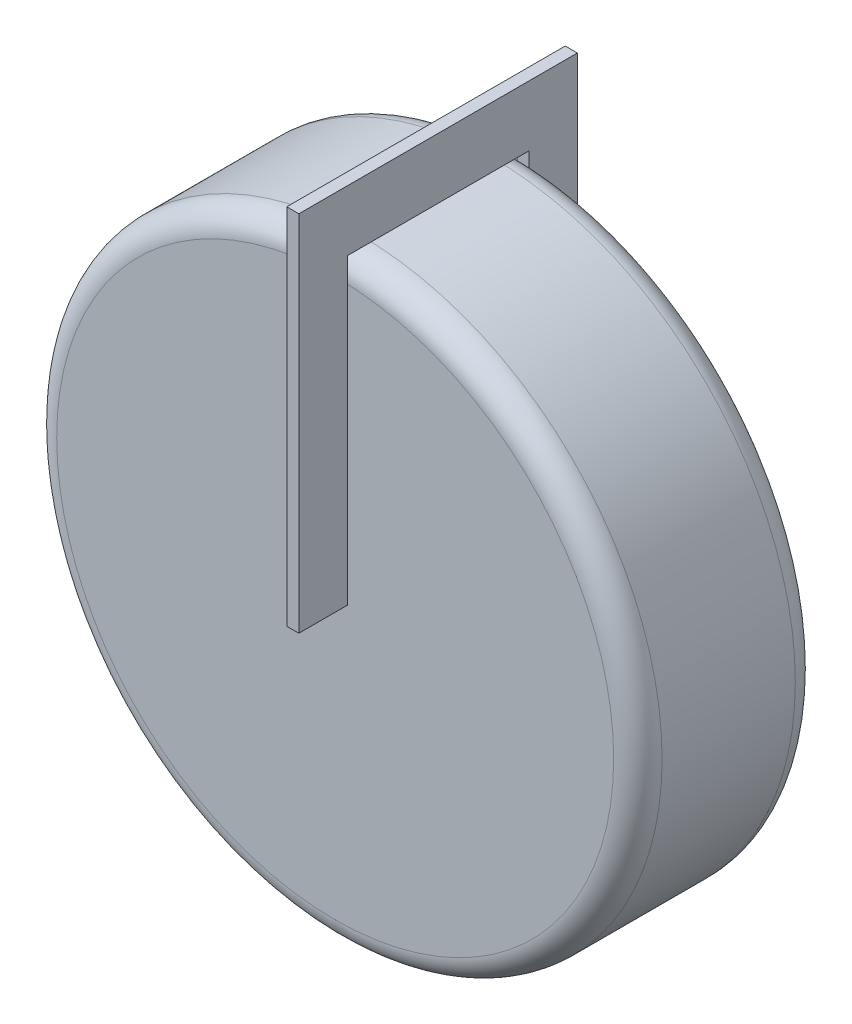
ISO-10303-21;
HEADER;
FILE_DESCRIPTION(('STEP AP214'),'2;1');
FILE_NAME('part.step','',(''),(''),'','','');
FILE_SCHEMA(('AUTOMOTIVE_DESIGN { 1 0 10303 214 1 1 1 1 }'));
ENDSEC;
DATA;
#1=APPLICATION_CONTEXT('core data for automotive mechanical design processes');
#2=APPLICATION_PROTOCOL_DEFINITION('international standard','automotive_design',2000,#1);
#3=PRODUCT_CONTEXT('',#1,'mechanical');
#4=PRODUCT('Part','Part','',(#3));
#5=PRODUCT_RELATED_PRODUCT_CATEGORY('part','',(#4));
#6=PRODUCT_DEFINITION_FORMATION('','',#4);
#7=PRODUCT_DEFINITION_CONTEXT('part definition',#1,'design');
#8=PRODUCT_DEFINITION('design','',#6,#7);
#9=PRODUCT_DEFINITION_SHAPE('','',#8);
#10=(LENGTH_UNIT() NAMED_UNIT(*) SI_UNIT(.MILLI.,.METRE.));
#11=(NAMED_UNIT(*) PLANE_ANGLE_UNIT() SI_UNIT($,.RADIAN.));
#12=(NAMED_UNIT(*) SI_UNIT($,.STERADIAN.) SOLID_ANGLE_UNIT());
#13=UNCERTAINTY_MEASURE_WITH_UNIT(LENGTH_MEASURE(1.E-05),#10,'distance_accuracy_value','');
#14=(GEOMETRIC_REPRESENTATION_CONTEXT(3) GLOBAL_UNCERTAINTY_ASSIGNED_CONTEXT((#13)) GLOBAL_UNIT_ASSIGNED_CONTEXT((#10,
#11,#12)) REPRESENTATION_CONTEXT('',''));
#15=CARTESIAN_POINT('',(0.,0.,0.));
#16=DIRECTION('',(0.,0.,1.));
#17=DIRECTION('',(1.,0.,0.));
#18=AXIS2_PLACEMENT_3D('',#15,#16,#17);
#19=CARTESIAN_POINT('',(1.,30.,0.));
#20=DIRECTION('',(0.,-1.,0.));
#21=DIRECTION('',(0.,0.,-1.));
#22=AXIS2_PLACEMENT_3D('',#19,#20,#21);
#23=PLANE('',#22);
#24=DIRECTION('',(0.,0.,1.));
#25=VECTOR('',#24,1.);
#26=CARTESIAN_POINT('',(0.,30.,0.));
#27=LINE('',#26,#25);
#28=CARTESIAN_POINT('',(0.,30.,-3.99999999999999));
#29=VERTEX_POINT('',#28);
#30=CARTESIAN_POINT('',(0.,30.,19.));
#31=VERTEX_POINT('',#30);
#32=EDGE_CURVE('E151',#29,#31,#27,.T.);
#33=ORIENTED_EDGE('',*,*,#32,.T.);
#34=DIRECTION('',(-1.,0.,0.));
#35=VECTOR('',#34,1.);
#36=CARTESIAN_POINT('',(1.,30.,19.));
#37=LINE('',#36,#35);
#38=CARTESIAN_POINT('',(1.,30.,19.));
#39=VERTEX_POINT('',#38);
#40=EDGE_CURVE('E12',#39,#31,#37,.T.);
#41=ORIENTED_EDGE('',*,*,#40,.F.);
#42=DIRECTION('',(0.,0.,1.));
#43=VECTOR('',#42,1.);
#44=CARTESIAN_POINT('',(1.,30.,0.));
#45=LINE('',#44,#43);
#46=CARTESIAN_POINT('',(1.,30.,-3.99999999999999));
#47=VERTEX_POINT('',#46);
#48=EDGE_CURVE('E169',#47,#39,#45,.T.);
#49=ORIENTED_EDGE('',*,*,#48,.F.);
#50=DIRECTION('',(-1.,0.,0.));
#51=VECTOR('',#50,1.);
#52=CARTESIAN_POINT('',(1.,30.,-3.99999999999999));
#53=LINE('',#52,#51);
#54=EDGE_CURVE('E150',#47,#29,#53,.T.);
#55=ORIENTED_EDGE('',*,*,#54,.T.);
#56=EDGE_LOOP('',(#33,#41,#49,#55));
#57=FACE_BOUND('',#56,.T.);
#58=ADVANCED_FACE('F53',(#57),#23,.F.);
#59=CARTESIAN_POINT('',(1.,0.,19.));
#60=DIRECTION('',(0.,0.,-1.));
#61=DIRECTION('',(-1.,0.,0.));
#62=AXIS2_PLACEMENT_3D('',#59,#60,#61);
#63=PLANE('',#62);
#64=DIRECTION('',(0.,-1.,0.));
#65=VECTOR('',#64,1.);
#66=CARTESIAN_POINT('',(0.,0.,19.));
#67=LINE('',#66,#65);
#68=CARTESIAN_POINT('',(0.,0.,19.));
#69=VERTEX_POINT('',#68);
#70=EDGE_CURVE('E154',#31,#69,#67,.T.);
#71=ORIENTED_EDGE('',*,*,#70,.T.);
#72=DIRECTION('',(-1.,0.,0.));
#73=VECTOR('',#72,1.);
#74=CARTESIAN_POINT('',(1.,0.,19.));
#75=LINE('',#74,#73);
#76=CARTESIAN_POINT('',(1.,0.,19.));
#77=VERTEX_POINT('',#76);
#78=EDGE_CURVE('E61',#77,#69,#75,.T.);
#79=ORIENTED_EDGE('',*,*,#78,.F.);
#80=DIRECTION('',(0.,-1.,0.));
#81=VECTOR('',#80,1.);
#82=CARTESIAN_POINT('',(1.,0.,19.));
#83=LINE('',#82,#81);
#84=EDGE_CURVE('E111',#39,#77,#83,.T.);
#85=ORIENTED_EDGE('',*,*,#84,.F.);
#86=ORIENTED_EDGE('',*,*,#40,.T.);
#87=EDGE_LOOP('',(#71,#79,#85,#86));
#88=FACE_BOUND('',#87,.T.);
#89=ADVANCED_FACE('F182',(#88),#63,.F.);
#90=CARTESIAN_POINT('',(1.,0.,0.));
#91=DIRECTION('',(0.,-1.,0.));
#92=DIRECTION('',(0.,0.,-1.));
#93=AXIS2_PLACEMENT_3D('',#90,#91,#92);
#94=PLANE('',#93);
#95=DIRECTION('',(0.,0.,1.));
#96=VECTOR('',#95,1.);
#97=CARTESIAN_POINT('',(0.,0.,0.));
#98=LINE('',#97,#96);
#99=CARTESIAN_POINT('',(0.,0.,15.));
#100=VERTEX_POINT('',#99);
#101=EDGE_CURVE('E157',#100,#69,#98,.T.);
#102=ORIENTED_EDGE('',*,*,#101,.F.);
#103=DIRECTION('',(-1.,0.,0.));
#104=VECTOR('',#103,1.);
#105=CARTESIAN_POINT('',(1.,0.,15.));
#106=LINE('',#105,#104);
#107=CARTESIAN_POINT('',(1.,0.,15.));
#108=VERTEX_POINT('',#107);
#109=EDGE_CURVE('E175',#108,#100,#106,.T.);
#110=ORIENTED_EDGE('',*,*,#109,.F.);
#111=DIRECTION('',(0.,0.,1.));
#112=VECTOR('',#111,1.);
#113=CARTESIAN_POINT('',(1.,0.,0.));
#114=LINE('',#113,#112);
#115=EDGE_CURVE('E181',#108,#77,#114,.T.);
#116=ORIENTED_EDGE('',*,*,#115,.T.);
#117=ORIENTED_EDGE('',*,*,#78,.T.);
#118=EDGE_LOOP('',(#102,#110,#116,#117));
#119=FACE_BOUND('',#118,.T.);
#120=ADVANCED_FACE('F179',(#119),#94,.T.);
#121=CARTESIAN_POINT('',(1.,0.,15.));
#122=DIRECTION('',(0.,0.,-1.));
#123=DIRECTION('',(0.,1.,0.));
#124=AXIS2_PLACEMENT_3D('',#121,#122,#123);
#125=PLANE('',#124);
#126=DIRECTION('',(0.,-1.,0.));
#127=VECTOR('',#126,1.);
#128=CARTESIAN_POINT('',(0.,0.,15.));
#129=LINE('',#128,#127);
#130=CARTESIAN_POINT('',(0.,25.,15.));
#131=VERTEX_POINT('',#130);
#132=EDGE_CURVE('E160',#131,#100,#129,.T.);
#133=ORIENTED_EDGE('',*,*,#132,.F.);
#134=DIRECTION('',(-1.,0.,0.));
#135=VECTOR('',#134,1.);
#136=CARTESIAN_POINT('',(1.,25.,15.));
#137=LINE('',#136,#135);
#138=CARTESIAN_POINT('',(1.,25.,15.));
#139=VERTEX_POINT('',#138);
#140=EDGE_CURVE('E173',#139,#131,#137,.T.);
#141=ORIENTED_EDGE('',*,*,#140,.F.);
#142=DIRECTION('',(0.,-1.,0.));
#143=VECTOR('',#142,1.);
#144=CARTESIAN_POINT('',(1.,0.,15.));
#145=LINE('',#144,#143);
#146=EDGE_CURVE('E145',#139,#108,#145,.T.);
#147=ORIENTED_EDGE('',*,*,#146,.T.);
#148=ORIENTED_EDGE('',*,*,#109,.T.);
#149=EDGE_LOOP('',(#133,#141,#147,#148));
#150=FACE_BOUND('',#149,.T.);
#151=ADVANCED_FACE('F190',(#150),#125,.T.);
#152=CARTESIAN_POINT('',(1.,25.,0.));
#153=DIRECTION('',(0.,-1.,0.));
#154=DIRECTION('',(0.,0.,-1.));
#155=AXIS2_PLACEMENT_3D('',#152,#153,#154);
#156=PLANE('',#155);
#157=DIRECTION('',(0.,0.,1.));
#158=VECTOR('',#157,1.);
#159=CARTESIAN_POINT('',(0.,25.,0.));
#160=LINE('',#159,#158);
#161=CARTESIAN_POINT('',(0.,25.,0.));
#162=VERTEX_POINT('',#161);
#163=EDGE_CURVE('E163',#162,#131,#160,.T.);
#164=ORIENTED_EDGE('',*,*,#163,.F.);
#165=DIRECTION('',(-1.,0.,0.));
#166=VECTOR('',#165,1.);
#167=CARTESIAN_POINT('',(1.,25.,0.));
#168=LINE('',#167,#166);
#169=CARTESIAN_POINT('',(1.,25.,0.));
#170=VERTEX_POINT('',#169);
#171=EDGE_CURVE('E133',#170,#162,#168,.T.);
#172=ORIENTED_EDGE('',*,*,#171,.F.);
#173=DIRECTION('',(0.,0.,1.));
#174=VECTOR('',#173,1.);
#175=CARTESIAN_POINT('',(1.,25.,0.));
#176=LINE('',#175,#174);
#177=EDGE_CURVE('E143',#170,#139,#176,.T.);
#178=ORIENTED_EDGE('',*,*,#177,.T.);
#179=ORIENTED_EDGE('',*,*,#140,.T.);
#180=EDGE_LOOP('',(#164,#172,#178,#179));
#181=FACE_BOUND('',#180,.T.);
#182=ADVANCED_FACE('F218',(#181),#156,.T.);
#183=CARTESIAN_POINT('',(1.,0.,0.));
#184=DIRECTION('',(0.,0.,1.));
#185=DIRECTION('',(0.,-1.,0.));
#186=AXIS2_PLACEMENT_3D('',#183,#184,#185);
#187=PLANE('',#186);
#188=DIRECTION('',(0.,1.,0.));
#189=VECTOR('',#188,1.);
#190=CARTESIAN_POINT('',(0.,0.,0.));
#191=LINE('',#190,#189);
#192=CARTESIAN_POINT('',(0.,0.,0.));
#193=VERTEX_POINT('',#192);
#194=EDGE_CURVE('E132',#193,#162,#191,.T.);
#195=ORIENTED_EDGE('',*,*,#194,.F.);
#196=DIRECTION('',(-1.,0.,0.));
#197=VECTOR('',#196,1.);
#198=CARTESIAN_POINT('',(1.,0.,0.));
#199=LINE('',#198,#197);
#200=CARTESIAN_POINT('',(1.,0.,0.));
#201=VERTEX_POINT('',#200);
#202=EDGE_CURVE('E126',#201,#193,#199,.T.);
#203=ORIENTED_EDGE('',*,*,#202,.F.);
#204=DIRECTION('',(0.,1.,0.));
#205=VECTOR('',#204,1.);
#206=CARTESIAN_POINT('',(1.,0.,0.));
#207=LINE('',#206,#205);
#208=EDGE_CURVE('E130',#201,#170,#207,.T.);
#209=ORIENTED_EDGE('',*,*,#208,.T.);
#210=ORIENTED_EDGE('',*,*,#171,.T.);
#211=EDGE_LOOP('',(#195,#203,#209,#210));
#212=FACE_BOUND('',#211,.T.);
#213=ADVANCED_FACE('F128',(#212),#187,.T.);
#214=CARTESIAN_POINT('',(1.,0.,0.));
#215=DIRECTION('',(0.,1.,0.));
#216=DIRECTION('',(0.,0.,1.));
#217=AXIS2_PLACEMENT_3D('',#214,#215,#216);
#218=PLANE('',#217);
#219=DIRECTION('',(0.,0.,-1.));
#220=VECTOR('',#219,1.);
#221=CARTESIAN_POINT('',(0.,0.,0.));
#222=LINE('',#221,#220);
#223=CARTESIAN_POINT('',(0.,0.,-4.));
#224=VERTEX_POINT('',#223);
#225=EDGE_CURVE('E97',#193,#224,#222,.T.);
#226=ORIENTED_EDGE('',*,*,#225,.T.);
#227=DIRECTION('',(-1.,0.,0.));
#228=VECTOR('',#227,1.);
#229=CARTESIAN_POINT('',(1.,0.,-4.));
#230=LINE('',#229,#228);
#231=CARTESIAN_POINT('',(1.,0.,-4.));
#232=VERTEX_POINT('',#231);
#233=EDGE_CURVE('E134',#232,#224,#230,.T.);
#234=ORIENTED_EDGE('',*,*,#233,.F.);
#235=DIRECTION('',(0.,0.,-1.));
#236=VECTOR('',#235,1.);
#237=CARTESIAN_POINT('',(1.,0.,0.));
#238=LINE('',#237,#236);
#239=EDGE_CURVE('E136',#201,#232,#238,.T.);
#240=ORIENTED_EDGE('',*,*,#239,.F.);
#241=ORIENTED_EDGE('',*,*,#202,.T.);
#242=EDGE_LOOP('',(#226,#234,#240,#241));
#243=FACE_BOUND('',#242,.T.);
#244=ADVANCED_FACE('F137',(#243),#218,.F.);
#245=CARTESIAN_POINT('',(1.,0.,-4.));
#246=DIRECTION('',(0.,0.,1.));
#247=DIRECTION('',(0.,-1.,0.));
#248=AXIS2_PLACEMENT_3D('',#245,#246,#247);
#249=PLANE('',#248);
#250=DIRECTION('',(0.,1.,0.));
#251=VECTOR('',#250,1.);
#252=CARTESIAN_POINT('',(0.,0.,-4.));
#253=LINE('',#252,#251);
#254=EDGE_CURVE('E103',#224,#29,#253,.T.);
#255=ORIENTED_EDGE('',*,*,#254,.T.);
#256=ORIENTED_EDGE('',*,*,#54,.F.);
#257=DIRECTION('',(0.,1.,0.));
#258=VECTOR('',#257,1.);
#259=CARTESIAN_POINT('',(1.,0.,-4.));
#260=LINE('',#259,#258);
#261=EDGE_CURVE('E69',#232,#47,#260,.T.);
#262=ORIENTED_EDGE('',*,*,#261,.F.);
#263=ORIENTED_EDGE('',*,*,#233,.T.);
#264=EDGE_LOOP('',(#255,#256,#262,#263));
#265=FACE_BOUND('',#264,.T.);
#266=ADVANCED_FACE('F197',(#265),#249,.F.);
#267=CARTESIAN_POINT('',(1.,0.,0.));
#268=DIRECTION('',(1.,0.,0.));
#269=DIRECTION('',(0.,0.,-1.));
#270=AXIS2_PLACEMENT_3D('',#267,#268,#269);
#271=PLANE('',#270);
#272=ORIENTED_EDGE('',*,*,#48,.T.);
#273=ORIENTED_EDGE('',*,*,#84,.T.);
#274=ORIENTED_EDGE('',*,*,#115,.F.);
#275=ORIENTED_EDGE('',*,*,#146,.F.);
#276=ORIENTED_EDGE('',*,*,#177,.F.);
#277=ORIENTED_EDGE('',*,*,#208,.F.);
#278=ORIENTED_EDGE('',*,*,#239,.T.);
#279=ORIENTED_EDGE('',*,*,#261,.T.);
#280=EDGE_LOOP('',(#272,#273,#274,#275,#276,#277,#278,#279));
#281=FACE_BOUND('',#280,.T.);
#282=ADVANCED_FACE('F140',(#281),#271,.T.);
#283=CARTESIAN_POINT('',(0.,0.,0.));
#284=DIRECTION('',(1.,0.,0.));
#285=DIRECTION('',(0.,0.,-1.));
#286=AXIS2_PLACEMENT_3D('',#283,#284,#285);
#287=PLANE('',#286);
#288=ORIENTED_EDGE('',*,*,#32,.F.);
#289=ORIENTED_EDGE('',*,*,#254,.F.);
#290=ORIENTED_EDGE('',*,*,#225,.F.);
#291=ORIENTED_EDGE('',*,*,#194,.T.);
#292=ORIENTED_EDGE('',*,*,#163,.T.);
#293=ORIENTED_EDGE('',*,*,#132,.T.);
#294=ORIENTED_EDGE('',*,*,#101,.T.);
#295=ORIENTED_EDGE('',*,*,#70,.F.);
#296=EDGE_LOOP('',(#288,#289,#290,#291,#292,#293,#294,#295));
#297=FACE_BOUND('',#296,.T.);
#298=ADVANCED_FACE('F186',(#297),#287,.F.);
#299=CLOSED_SHELL('',(#58,#89,#120,#151,#182,#213,#244,#266,#282,#298));
#300=MANIFOLD_SOLID_BREP('B2',#299);
#301=CARTESIAN_POINT('',(0.,0.,15.));
#302=DIRECTION('',(0.,0.,-1.));
#303=DIRECTION('',(-1.,0.,0.));
#304=AXIS2_PLACEMENT_3D('',#301,#302,#303);
#305=CYLINDRICAL_SURFACE('',#304,25.);
#306=CARTESIAN_POINT('',(0.,0.,13.));
#307=DIRECTION('',(0.,0.,1.));
#308=DIRECTION('',(1.,0.,0.));
#309=AXIS2_PLACEMENT_3D('',#306,#307,#308);
#310=CIRCLE('',#309,25.);
#311=CARTESIAN_POINT('',(25.,0.,13.));
#312=VERTEX_POINT('',#311);
#313=EDGE_CURVE('E313',#312,#312,#310,.F.);
#314=ORIENTED_EDGE('',*,*,#313,.T.);
#315=EDGE_LOOP('',(#314));
#316=FACE_BOUND('',#315,.T.);
#317=CARTESIAN_POINT('',(0.,0.,2.));
#318=DIRECTION('',(0.,0.,1.));
#319=DIRECTION('',(1.,0.,0.));
#320=AXIS2_PLACEMENT_3D('',#317,#318,#319);
#321=CIRCLE('',#320,25.);
#322=CARTESIAN_POINT('',(25.,0.,2.));
#323=VERTEX_POINT('',#322);
#324=EDGE_CURVE('E318',#323,#323,#321,.T.);
#325=ORIENTED_EDGE('',*,*,#324,.T.);
#326=EDGE_LOOP('',(#325));
#327=FACE_BOUND('',#326,.T.);
#328=ADVANCED_FACE('F305',(#316,#327),#305,.T.);
#329=CARTESIAN_POINT('',(0.,0.,15.));
#330=DIRECTION('',(0.,0.,1.));
#331=DIRECTION('',(1.,0.,0.));
#332=AXIS2_PLACEMENT_3D('',#329,#330,#331);
#333=PLANE('',#332);
#334=CARTESIAN_POINT('',(0.,0.,15.));
#335=DIRECTION('',(0.,0.,1.));
#336=DIRECTION('',(1.,0.,0.));
#337=AXIS2_PLACEMENT_3D('',#334,#335,#336);
#338=CIRCLE('',#337,23.);
#339=CARTESIAN_POINT('',(23.,0.,15.));
#340=VERTEX_POINT('',#339);
#341=EDGE_CURVE('E323',#340,#340,#338,.T.);
#342=ORIENTED_EDGE('',*,*,#341,.T.);
#343=EDGE_LOOP('',(#342));
#344=FACE_BOUND('',#343,.T.);
#345=ADVANCED_FACE('F330',(#344),#333,.T.);
#346=CARTESIAN_POINT('',(0.,0.,0.));
#347=DIRECTION('',(0.,0.,1.));
#348=DIRECTION('',(1.,0.,0.));
#349=AXIS2_PLACEMENT_3D('',#346,#347,#348);
#350=PLANE('',#349);
#351=CARTESIAN_POINT('',(0.,0.,0.));
#352=DIRECTION('',(0.,0.,1.));
#353=DIRECTION('',(1.,0.,0.));
#354=AXIS2_PLACEMENT_3D('',#351,#352,#353);
#355=CIRCLE('',#354,23.);
#356=CARTESIAN_POINT('',(23.,0.,0.));
#357=VERTEX_POINT('',#356);
#358=EDGE_CURVE('E52',#357,#357,#355,.F.);
#359=ORIENTED_EDGE('',*,*,#358,.T.);
#360=EDGE_LOOP('',(#359));
#361=FACE_BOUND('',#360,.T.);
#362=ADVANCED_FACE('F334',(#361),#350,.F.);
#363=CARTESIAN_POINT('',(0.,0.,13.));
#364=DIRECTION('',(0.,0.,1.));
#365=DIRECTION('',(1.,0.,0.));
#366=AXIS2_PLACEMENT_3D('',#363,#364,#365);
#367=TOROIDAL_SURFACE('',#366,23.,2.);
#368=ORIENTED_EDGE('',*,*,#313,.F.);
#369=EDGE_LOOP('',(#368));
#370=FACE_BOUND('',#369,.T.);
#371=ORIENTED_EDGE('',*,*,#341,.F.);
#372=EDGE_LOOP('',(#371));
#373=FACE_BOUND('',#372,.T.);
#374=ADVANCED_FACE('F332',(#370,#373),#367,.T.);
#375=CARTESIAN_POINT('',(0.,0.,2.));
#376=DIRECTION('',(0.,0.,1.));
#377=DIRECTION('',(1.,0.,0.));
#378=AXIS2_PLACEMENT_3D('',#375,#376,#377);
#379=TOROIDAL_SURFACE('',#378,23.,2.);
#380=ORIENTED_EDGE('',*,*,#358,.F.);
#381=EDGE_LOOP('',(#380));
#382=FACE_BOUND('',#381,.T.);
#383=ORIENTED_EDGE('',*,*,#324,.F.);
#384=EDGE_LOOP('',(#383));
#385=FACE_BOUND('',#384,.T.);
#386=ADVANCED_FACE('F307',(#382,#385),#379,.T.);
#387=CLOSED_SHELL('',(#328,#345,#362,#374,#386));
#388=MANIFOLD_SOLID_BREP('B6',#387);
#389=ADVANCED_BREP_SHAPE_REPRESENTATION('',(#18,#300,#388),#14);
#390=SHAPE_DEFINITION_REPRESENTATION(#9,#389);
ENDSEC;
END-ISO-10303-21;
